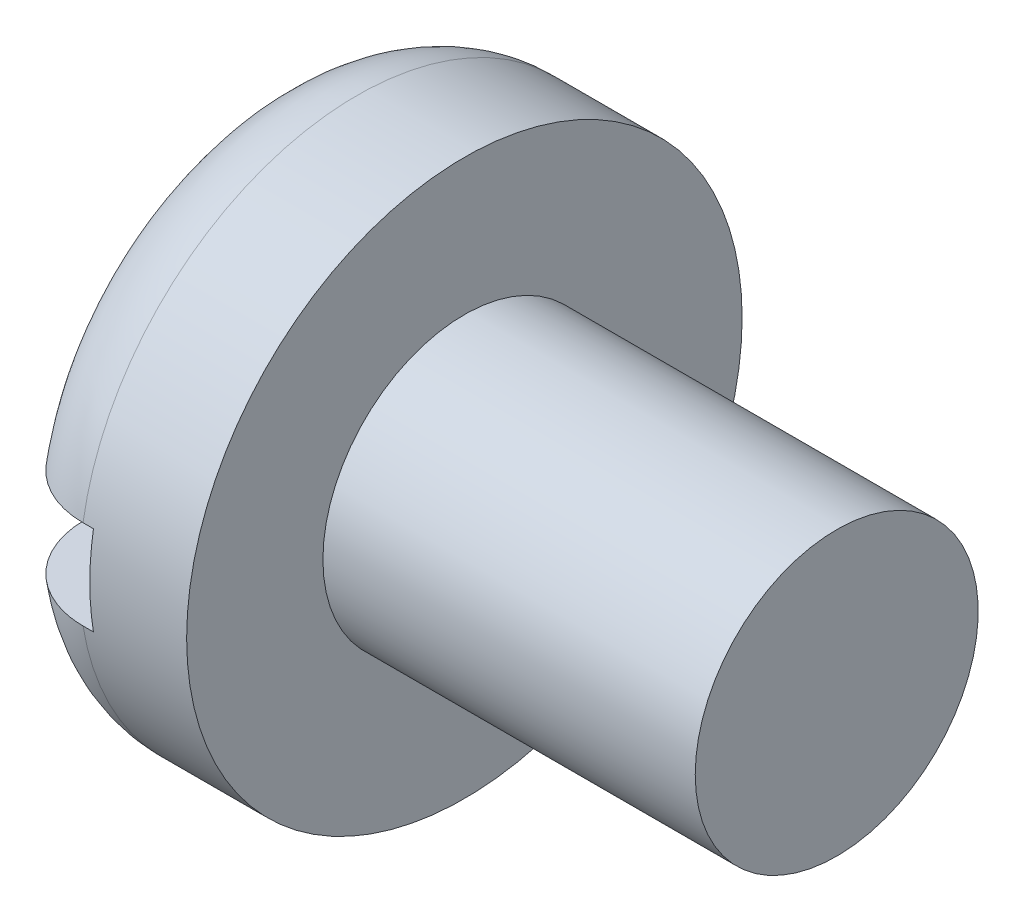
ISO-10303-21;
HEADER;
FILE_DESCRIPTION(('STEP AP214'),'2;1');
FILE_NAME('part.step','',(''),(''),'','','');
FILE_SCHEMA(('AUTOMOTIVE_DESIGN { 1 0 10303 214 1 1 1 1 }'));
ENDSEC;
DATA;
#1=APPLICATION_CONTEXT('core data for automotive mechanical design processes');
#2=APPLICATION_PROTOCOL_DEFINITION('international standard','automotive_design',2000,#1);
#3=PRODUCT_CONTEXT('',#1,'mechanical');
#4=PRODUCT('Part','Part','',(#3));
#5=PRODUCT_RELATED_PRODUCT_CATEGORY('part','',(#4));
#6=PRODUCT_DEFINITION_FORMATION('','',#4);
#7=PRODUCT_DEFINITION_CONTEXT('part definition',#1,'design');
#8=PRODUCT_DEFINITION('design','',#6,#7);
#9=PRODUCT_DEFINITION_SHAPE('','',#8);
#10=(LENGTH_UNIT() NAMED_UNIT(*) SI_UNIT(.MILLI.,.METRE.));
#11=(NAMED_UNIT(*) PLANE_ANGLE_UNIT() SI_UNIT($,.RADIAN.));
#12=(NAMED_UNIT(*) SI_UNIT($,.STERADIAN.) SOLID_ANGLE_UNIT());
#13=UNCERTAINTY_MEASURE_WITH_UNIT(LENGTH_MEASURE(1.E-05),#10,'distance_accuracy_value','');
#14=(GEOMETRIC_REPRESENTATION_CONTEXT(3) GLOBAL_UNCERTAINTY_ASSIGNED_CONTEXT((#13)) GLOBAL_UNIT_ASSIGNED_CONTEXT((#10,
#11,#12)) REPRESENTATION_CONTEXT('',''));
#15=CARTESIAN_POINT('',(0.,0.,0.));
#16=DIRECTION('',(0.,0.,1.));
#17=DIRECTION('',(1.,0.,0.));
#18=AXIS2_PLACEMENT_3D('',#15,#16,#17);
#19=CARTESIAN_POINT('',(0.,0.,0.));
#20=DIRECTION('',(-1.,0.,0.));
#21=DIRECTION('',(0.,0.,1.));
#22=AXIS2_PLACEMENT_3D('',#19,#20,#21);
#23=PLANE('',#22);
#24=DIRECTION('',(0.,0.,-1.));
#25=VECTOR('',#24,1.);
#26=CARTESIAN_POINT('',(0.,0.762,4.7371));
#27=LINE('',#26,#25);
#28=CARTESIAN_POINT('',(0.,0.762,3.09528468642224));
#29=VERTEX_POINT('',#28);
#30=CARTESIAN_POINT('',(0.,0.762,-3.09528468642224));
#31=VERTEX_POINT('',#30);
#32=EDGE_CURVE('E261',#29,#31,#27,.T.);
#33=ORIENTED_EDGE('',*,*,#32,.F.);
#34=CARTESIAN_POINT('',(0.,0.,0.));
#35=DIRECTION('',(-1.,0.,0.));
#36=DIRECTION('',(0.,0.,1.));
#37=AXIS2_PLACEMENT_3D('',#34,#35,#36);
#38=CIRCLE('',#37,3.1877);
#39=EDGE_CURVE('E131',#29,#31,#38,.T.);
#40=ORIENTED_EDGE('',*,*,#39,.T.);
#41=EDGE_LOOP('',(#33,#40));
#42=FACE_BOUND('',#41,.T.);
#43=ADVANCED_FACE('F32',(#42),#23,.T.);
#44=CARTESIAN_POINT('',(1.5494,0.,0.));
#45=DIRECTION('',(-1.,0.,0.));
#46=DIRECTION('',(0.,0.,1.));
#47=AXIS2_PLACEMENT_3D('',#44,#45,#46);
#48=TOROIDAL_SURFACE('',#47,3.1877,1.5494);
#49=CARTESIAN_POINT('',(0.558501926112813,0.762,-4.31200654221501));
#50=CARTESIAN_POINT('',(0.624503765178296,0.762,-4.36775976444543));
#51=CARTESIAN_POINT('',(0.695225612382896,0.762,-4.41801942633811));
#52=CARTESIAN_POINT('',(0.844151505124433,0.762,-4.50601316224373));
#53=CARTESIAN_POINT('',(0.92236377185654,0.762,-4.54373326559598));
#54=CARTESIAN_POINT('',(1.08401891834316,0.762,-4.60546698185312));
#55=CARTESIAN_POINT('',(1.16746096990279,0.762,-4.62948275893514));
#56=CARTESIAN_POINT('',(1.33718114742581,0.762,-4.66308214358628));
#57=CARTESIAN_POINT('',(1.42345859347076,0.762,-4.67266918568556));
#58=CARTESIAN_POINT('',(1.59599349656326,0.762,-4.67712431371996));
#59=CARTESIAN_POINT('',(1.68224921080963,0.762,-4.67206007620656));
#60=CARTESIAN_POINT('',(1.85268417612877,0.762,-4.64750973320941));
#61=CARTESIAN_POINT('',(1.93686338831987,0.762,-4.62802335788842));
#62=CARTESIAN_POINT('',(2.10070146714753,0.762,-4.57522932891186));
#63=CARTESIAN_POINT('',(2.18036349269632,0.762,-4.54193147270308));
#64=CARTESIAN_POINT('',(2.33300611410088,0.762,-4.46250229126884));
#65=CARTESIAN_POINT('',(2.40598663500396,0.762,-4.41637082210019));
#66=CARTESIAN_POINT('',(2.54363358967117,0.762,-4.31234809282823));
#67=CARTESIAN_POINT('',(2.60825349473607,0.762,-4.25439528847686));
#68=CARTESIAN_POINT('',(2.7269818437665,0.762,-4.12857654655652));
#69=CARTESIAN_POINT('',(2.78108986335902,0.762,-4.06071020896418));
#70=CARTESIAN_POINT('',(2.87797164647719,0.762,-3.91615697530799));
#71=CARTESIAN_POINT('',(2.92060423415085,0.762,-3.83937550496835));
#72=CARTESIAN_POINT('',(2.99264178355763,0.762,-3.67984555690315));
#73=CARTESIAN_POINT('',(3.02204576344207,0.762,-3.59709663679252));
#74=CARTESIAN_POINT('',(3.0674229439684,0.762,-3.42631831980952));
#75=CARTESIAN_POINT('',(3.08313122405948,0.762,-3.33821859562874));
#76=CARTESIAN_POINT('',(3.0999361869237,0.762,-3.16064155502913));
#77=CARTESIAN_POINT('',(3.10103109825849,0.762,-3.07116407291408));
#78=CARTESIAN_POINT('',(3.08863195089354,0.762,-2.89088001580641));
#79=CARTESIAN_POINT('',(3.0747561792964,0.762,-2.80009974893249));
#80=CARTESIAN_POINT('',(3.03240614015427,0.762,-2.62201403782426));
#81=CARTESIAN_POINT('',(3.003929743395,0.762,-2.53470910240041));
#82=CARTESIAN_POINT('',(2.93225598384751,0.762,-2.36335935596212));
#83=CARTESIAN_POINT('',(2.88865356948883,0.762,-2.27948384722805));
#84=CARTESIAN_POINT('',(2.78818886774452,0.762,-2.12005822859611));
#85=CARTESIAN_POINT('',(2.7313226216521,0.762,-2.04451061416379));
#86=CARTESIAN_POINT('',(2.60484528137299,0.762,-1.90291211039867));
#87=CARTESIAN_POINT('',(2.53505925121009,0.762,-1.83701701567932));
#88=CARTESIAN_POINT('',(2.38500386232213,0.762,-1.71842259658186));
#89=CARTESIAN_POINT('',(2.30473534648684,0.762,-1.66572221221867));
#90=CARTESIAN_POINT('',(2.1392769109821,0.762,-1.5779040098912));
#91=CARTESIAN_POINT('',(2.0544264707299,0.762,-1.54215071063406));
#92=CARTESIAN_POINT('',(1.87951633706692,0.762,-1.48738077821787));
#93=CARTESIAN_POINT('',(1.78946346838352,0.762,-1.46834272591055));
#94=CARTESIAN_POINT('',(1.61717517770843,0.762,-1.44955306798709));
#95=CARTESIAN_POINT('',(1.53513920825877,0.762,-1.44794929123912));
#96=CARTESIAN_POINT('',(1.37209641155018,0.762,-1.45935294652019));
#97=CARTESIAN_POINT('',(1.29108950257593,0.762,-1.47235921097167));
#98=CARTESIAN_POINT('',(1.13651467818854,0.762,-1.51109533500834));
#99=CARTESIAN_POINT('',(1.06277718056366,0.762,-1.53615976675215));
#100=CARTESIAN_POINT('',(0.920086745041454,0.762,-1.59740532257714));
#101=CARTESIAN_POINT('',(0.851135247588265,0.762,-1.63358977582331));
#102=CARTESIAN_POINT('',(0.714108958882072,0.762,-1.718942347567));
#103=CARTESIAN_POINT('',(0.646533107651883,0.762,-1.76890994938072));
#104=CARTESIAN_POINT('',(0.519751374159238,0.762,-1.87852173742569));
#105=CARTESIAN_POINT('',(0.460548759697031,0.762,-1.93816968218281));
#106=CARTESIAN_POINT('',(0.346254502132061,0.762,-2.07188493390445));
#107=CARTESIAN_POINT('',(0.29214506715978,0.762,-2.14679431352348));
#108=CARTESIAN_POINT('',(0.19671918327371,0.762,-2.3043706901364));
#109=CARTESIAN_POINT('',(0.155405793463288,0.762,-2.38703953601168));
#110=CARTESIAN_POINT('',(0.0854433911441305,0.762,-2.56120465276297));
#111=CARTESIAN_POINT('',(0.0573261553510626,0.762,-2.65291549272235));
#112=CARTESIAN_POINT('',(0.0171259943740959,0.762,-2.8397904136162));
#113=CARTESIAN_POINT('',(0.00504179955930095,0.762,-2.93495422050255));
#114=CARTESIAN_POINT('',(-0.00243284394224364,0.762,-3.12460002150441));
#115=CARTESIAN_POINT('',(0.00194367985651755,0.762,-3.21907270376819));
#116=CARTESIAN_POINT('',(0.0270030891088849,0.762,-3.40586311939546));
#117=CARTESIAN_POINT('',(0.0476878324962477,0.762,-3.49818060599176));
#118=CARTESIAN_POINT('',(0.104114452891124,0.762,-3.67512039467312));
#119=CARTESIAN_POINT('',(0.139399899815146,0.762,-3.75988855837092));
#120=CARTESIAN_POINT('',(0.224057804267139,0.762,-3.92197904384711));
#121=CARTESIAN_POINT('',(0.273409971778087,0.762,-3.99931187711906));
#122=CARTESIAN_POINT('',(0.362898030591871,0.762,-4.11569846401721));
#123=CARTESIAN_POINT('',(0.399055729448776,0.762,-4.15786879061876));
#124=CARTESIAN_POINT('',(0.47566051263418,0.762,-4.23811705888542));
#125=CARTESIAN_POINT('',(0.516107536686558,0.762,-4.27619505804318));
#126=CARTESIAN_POINT('',(0.558501926112813,0.762,-4.31200654221501));
#127=B_SPLINE_CURVE_WITH_KNOTS('',3,(#49,#50,#51,#52,#53,#54,#55,#56,#57,#58,#59,#60,#61,#62,
#63,#64,#65,#66,#67,#68,#69,#70,#71,#72,#73,#74,#75,#76,#77,#78,#79,#80,#81,#82,#83,#84,#85,#86,
#87,#88,#89,#90,#91,#92,#93,#94,#95,#96,#97,#98,#99,#100,#101,#102,#103,#104,#105,#106,#107,
#108,#109,#110,#111,#112,#113,#114,#115,#116,#117,#118,#119,#120,#121,#122,#123,#124,#125,#126),
.UNSPECIFIED.,.T.,.F.,(4,2,2,2,2,2,2,2,2,2,2,2,2,2,2,2,2,2,2,2,2,2,2,2,2,2,2,2,2,2,2,2,2,2,2,2,
2,2,4),(0.,0.258994101891505,0.518275796538277,0.777516534271254,1.03669555411752,
1.294679299718,1.5526678722994,1.8104737477287,2.06828251485318,2.327469409344,2.58666676523829,
2.84892054584938,3.11119378815068,3.37843437188519,3.64570735033487,3.91995971046609,
4.19425207629513,4.47654284617027,4.75891797625169,5.04544083164771,5.33194066209959,
5.60662511443543,5.88095706643619,6.12581843539237,6.370660237374,6.60331700855526,
6.83604350159712,7.08714261010997,7.33833944556595,7.61432498378245,7.89037645000936,
8.17675822425533,8.46311731903239,8.74543790736012,9.02779066405281,9.30191390829516,
9.57564373745578,9.7420035123932,9.90836094985487),.UNSPECIFIED.);
#128=CARTESIAN_POINT('',(1.5494,0.762,-4.67541146959281));
#129=VERTEX_POINT('',#128);
#130=EDGE_CURVE('E46',#31,#129,#127,.T.);
#131=ORIENTED_EDGE('',*,*,#130,.F.);
#132=ORIENTED_EDGE('',*,*,#39,.F.);
#133=CARTESIAN_POINT('',(1.37882833369921,0.762,1.4609344351458));
#134=CARTESIAN_POINT('',(1.45767778229447,0.762,1.45109091146304));
#135=CARTESIAN_POINT('',(1.53743300171642,0.762,1.44805959139375));
#136=CARTESIAN_POINT('',(1.69630228200223,0.762,1.45586904693911));
#137=CARTESIAN_POINT('',(1.77541569477307,0.762,1.46672242384202));
#138=CARTESIAN_POINT('',(1.93043550787148,0.762,1.50154368703999));
#139=CARTESIAN_POINT('',(2.00635040021149,0.762,1.52547413451916));
#140=CARTESIAN_POINT('',(2.1533726247622,0.762,1.58512438315103));
#141=CARTESIAN_POINT('',(2.22447868224917,0.762,1.62084729560072));
#142=CARTESIAN_POINT('',(2.36380098660427,0.762,1.70461613595374));
#143=CARTESIAN_POINT('',(2.43170447465362,0.762,1.75318050771669));
#144=CARTESIAN_POINT('',(2.55937219356342,0.762,1.8600211612785));
#145=CARTESIAN_POINT('',(2.61913392215934,0.762,1.91830041663955));
#146=CARTESIAN_POINT('',(2.73503598097005,0.762,2.04940817358317));
#147=CARTESIAN_POINT('',(2.79018656319344,0.762,2.12311412557353));
#148=CARTESIAN_POINT('',(2.88792514517709,0.762,2.27844361261995));
#149=CARTESIAN_POINT('',(2.93050965826346,0.762,2.3600693368217));
#150=CARTESIAN_POINT('',(3.00341128676537,0.762,2.53260720000707));
#151=CARTESIAN_POINT('',(3.03315502097171,0.762,2.62376267670105));
#152=CARTESIAN_POINT('',(3.07671140531373,0.762,2.80981066624688));
#153=CARTESIAN_POINT('',(3.0905245995442,0.762,2.90470305135316));
#154=CARTESIAN_POINT('',(3.10149739213467,0.762,3.09429234838807));
#155=CARTESIAN_POINT('',(3.09885850646894,0.762,3.18897746953199));
#156=CARTESIAN_POINT('',(3.07721758868585,0.762,3.37646433803129));
#157=CARTESIAN_POINT('',(3.05821795703654,0.762,3.46926635963284));
#158=CARTESIAN_POINT('',(3.00500613590422,0.762,3.64742438271371));
#159=CARTESIAN_POINT('',(2.97125875943939,0.762,3.7329192213955));
#160=CARTESIAN_POINT('',(2.88950418407281,0.762,3.89679807877195));
#161=CARTESIAN_POINT('',(2.84149915242691,0.762,3.97518317583111));
#162=CARTESIAN_POINT('',(2.73400432376312,0.762,4.12041160126862));
#163=CARTESIAN_POINT('',(2.67485481945552,0.762,4.18750691479756));
#164=CARTESIAN_POINT('',(2.54593690180154,0.762,4.31057586450795));
#165=CARTESIAN_POINT('',(2.47616967288336,0.762,4.36655073959268));
#166=CARTESIAN_POINT('',(2.32943350764576,0.762,4.46470134856446));
#167=CARTESIAN_POINT('',(2.25262544262633,0.762,4.50711769840939));
#168=CARTESIAN_POINT('',(2.09291894695908,0.762,4.57828304222571));
#169=CARTESIAN_POINT('',(2.01002094460928,0.762,4.60703299627798));
#170=CARTESIAN_POINT('',(1.84150019062737,0.762,4.64974258940861));
#171=CARTESIAN_POINT('',(1.75591889822596,0.762,4.66386594716439));
#172=CARTESIAN_POINT('',(1.58360123646141,0.762,4.67746939166987));
#173=CARTESIAN_POINT('',(1.49686490828539,0.762,4.67694999917148));
#174=CARTESIAN_POINT('',(1.32513063187046,0.762,4.6613215764109));
#175=CARTESIAN_POINT('',(1.24012642731877,0.762,4.64628115948126));
#176=CARTESIAN_POINT('',(1.07384531926871,0.762,4.60216090883303));
#177=CARTESIAN_POINT('',(0.992568393414692,0.762,4.57308115933222));
#178=CARTESIAN_POINT('',(0.835914381286785,0.762,4.50169622747781));
#179=CARTESIAN_POINT('',(0.760545540632384,0.762,4.45937295876651));
#180=CARTESIAN_POINT('',(0.617915726171508,0.762,4.36276228903086));
#181=CARTESIAN_POINT('',(0.550654940865141,0.762,4.3084746099349));
#182=CARTESIAN_POINT('',(0.425586504282354,0.762,4.18906699603163));
#183=CARTESIAN_POINT('',(0.367853500016325,0.762,4.12386890642169));
#184=CARTESIAN_POINT('',(0.26397492755456,0.762,3.98482211119811));
#185=CARTESIAN_POINT('',(0.217829943315976,0.762,3.91097296990538));
#186=CARTESIAN_POINT('',(0.137704223529321,0.762,3.75562007058942));
#187=CARTESIAN_POINT('',(0.103905208312929,0.762,3.6740226386045));
#188=CARTESIAN_POINT('',(0.0501687362886253,0.762,3.50638994597293));
#189=CARTESIAN_POINT('',(0.0302325582974674,0.762,3.42035427669465));
#190=CARTESIAN_POINT('',(0.00429460618638988,0.762,3.24431959617554));
#191=CARTESIAN_POINT('',(-0.00139829341690311,0.762,3.15427514183594));
#192=CARTESIAN_POINT('',(0.00197952351395726,0.762,2.97446875605361));
#193=CARTESIAN_POINT('',(0.0110521538081449,0.762,2.88470686274444));
#194=CARTESIAN_POINT('',(0.0439664152909467,0.762,2.70532877683696));
#195=CARTESIAN_POINT('',(0.0682152853217969,0.762,2.61578733481287));
#196=CARTESIAN_POINT('',(0.130993773920929,0.762,2.44186007826723));
#197=CARTESIAN_POINT('',(0.169525419479398,0.762,2.35747499750977));
#198=CARTESIAN_POINT('',(0.260980479006912,0.762,2.19386732852946));
#199=CARTESIAN_POINT('',(0.314265924139127,0.762,2.11484686428402));
#200=CARTESIAN_POINT('',(0.433350313250186,0.762,1.96677891182421));
#201=CARTESIAN_POINT('',(0.499156847458473,0.762,1.89773751778139));
#202=CARTESIAN_POINT('',(0.641776309859398,0.762,1.77184054558599));
#203=CARTESIAN_POINT('',(0.718608095024868,0.762,1.7150062703571));
#204=CARTESIAN_POINT('',(0.881210651545337,0.762,1.61621194564139));
#205=CARTESIAN_POINT('',(0.966961725807488,0.762,1.57421998500052));
#206=CARTESIAN_POINT('',(1.10793905580931,0.762,1.52136420348251));
#207=CARTESIAN_POINT('',(1.16108363018855,0.762,1.50481253647326));
#208=CARTESIAN_POINT('',(1.26894730021348,0.762,1.47804132435307));
#209=CARTESIAN_POINT('',(1.3236661639158,0.762,1.46782085140271));
#210=CARTESIAN_POINT('',(1.37882833369921,0.762,1.4609344351458));
#211=B_SPLINE_CURVE_WITH_KNOTS('',3,(#133,#134,#135,#136,#137,#138,#139,#140,#141,#142,#143,
#144,#145,#146,#147,#148,#149,#150,#151,#152,#153,#154,#155,#156,#157,#158,#159,#160,#161,#162,
#163,#164,#165,#166,#167,#168,#169,#170,#171,#172,#173,#174,#175,#176,#177,#178,#179,#180,#181,
#182,#183,#184,#185,#186,#187,#188,#189,#190,#191,#192,#193,#194,#195,#196,#197,#198,#199,#200,
#201,#202,#203,#204,#205,#206,#207,#208,#209,#210),.UNSPECIFIED.,.T.,.F.,(4,2,2,2,2,2,2,2,2,2,2,
2,2,2,2,2,2,2,2,2,2,2,2,2,2,2,2,2,2,2,2,2,2,2,2,2,2,2,4),(0.,0.238172297169051,
0.476560905003676,0.714270570137412,0.952043002238672,1.20147671068863,1.45098690725547,
1.72592511426441,2.00093953607151,2.28720918580222,2.57346905793364,2.85622957585298,
3.13894861388137,3.41333595437419,3.68768160754365,3.95471342007754,4.22171546648852,
4.48367558515077,4.74561729807635,5.0045942680148,5.26356202775844,5.52131209673926,
5.77906061957298,6.03716269109025,6.29527076193622,6.55531378193514,6.81536990369968,
7.0791127102478,7.34287984327296,7.61231920604479,7.88179349362824,8.15882855198505,
8.43590294180611,8.7204930804325,9.00525628918085,9.29051247812746,9.57515157785255,
9.74179861294387,9.90842122005407),.UNSPECIFIED.);
#212=CARTESIAN_POINT('',(1.5494,0.762,4.67541146959281));
#213=VERTEX_POINT('',#212);
#214=EDGE_CURVE('E175',#213,#29,#211,.T.);
#215=ORIENTED_EDGE('',*,*,#214,.F.);
#216=CARTESIAN_POINT('',(1.5494,0.,0.));
#217=DIRECTION('',(-1.,0.,0.));
#218=DIRECTION('',(0.,0.,1.));
#219=AXIS2_PLACEMENT_3D('',#216,#217,#218);
#220=CIRCLE('',#219,4.7371);
#221=EDGE_CURVE('E104',#213,#129,#220,.T.);
#222=ORIENTED_EDGE('',*,*,#221,.T.);
#223=EDGE_LOOP('',(#131,#132,#215,#222));
#224=FACE_BOUND('',#223,.T.);
#225=ADVANCED_FACE('F148',(#224),#48,.T.);
#226=CARTESIAN_POINT('',(-25.4,0.,0.));
#227=DIRECTION('',(-1.,0.,0.));
#228=DIRECTION('',(0.,0.,1.));
#229=AXIS2_PLACEMENT_3D('',#226,#227,#228);
#230=CYLINDRICAL_SURFACE('',#229,2.413);
#231=CARTESIAN_POINT('',(9.7282,0.,0.));
#232=DIRECTION('',(-1.,0.,0.));
#233=DIRECTION('',(0.,0.,1.));
#234=AXIS2_PLACEMENT_3D('',#231,#232,#233);
#235=CIRCLE('',#234,2.413);
#236=CARTESIAN_POINT('',(9.7282,0.,2.413));
#237=VERTEX_POINT('',#236);
#238=EDGE_CURVE('E94',#237,#237,#235,.T.);
#239=ORIENTED_EDGE('',*,*,#238,.T.);
#240=EDGE_LOOP('',(#239));
#241=FACE_BOUND('',#240,.T.);
#242=CARTESIAN_POINT('',(3.3782,0.,0.));
#243=DIRECTION('',(-1.,0.,0.));
#244=DIRECTION('',(0.,0.,1.));
#245=AXIS2_PLACEMENT_3D('',#242,#243,#244);
#246=CIRCLE('',#245,2.413);
#247=CARTESIAN_POINT('',(3.3782,0.,2.413));
#248=VERTEX_POINT('',#247);
#249=EDGE_CURVE('E127',#248,#248,#246,.T.);
#250=ORIENTED_EDGE('',*,*,#249,.F.);
#251=EDGE_LOOP('',(#250));
#252=FACE_BOUND('',#251,.T.);
#253=ADVANCED_FACE('F34',(#241,#252),#230,.T.);
#254=CARTESIAN_POINT('',(9.7282,2.413,0.));
#255=DIRECTION('',(1.,0.,0.));
#256=DIRECTION('',(0.,0.,-1.));
#257=AXIS2_PLACEMENT_3D('',#254,#255,#256);
#258=PLANE('',#257);
#259=ORIENTED_EDGE('',*,*,#238,.F.);
#260=EDGE_LOOP('',(#259));
#261=FACE_BOUND('',#260,.T.);
#262=ADVANCED_FACE('F139',(#261),#258,.T.);
#263=DIRECTION('',(0.,0.,1.));
#264=VECTOR('',#263,1.);
#265=CARTESIAN_POINT('',(0.,-0.761999999999999,-4.7371));
#266=LINE('',#265,#264);
#267=CARTESIAN_POINT('',(0.,-0.761999999999999,-3.09528468642224));
#268=VERTEX_POINT('',#267);
#269=CARTESIAN_POINT('',(0.,-0.762,3.09528468642224));
#270=VERTEX_POINT('',#269);
#271=EDGE_CURVE('E98',#268,#270,#266,.T.);
#272=ORIENTED_EDGE('',*,*,#271,.F.);
#273=EDGE_CURVE('E121',#268,#270,#38,.T.);
#274=ORIENTED_EDGE('',*,*,#273,.T.);
#275=EDGE_LOOP('',(#272,#274));
#276=FACE_BOUND('',#275,.T.);
#277=ADVANCED_FACE('F141',(#276),#23,.T.);
#278=CARTESIAN_POINT('',(0.558501926112812,-0.761999999999999,-4.31200654221501));
#279=CARTESIAN_POINT('',(0.491152564912093,-0.761999999999999,-4.25510429288787));
#280=CARTESIAN_POINT('',(0.428614834513411,-0.761999999999999,-4.19239155349494));
#281=CARTESIAN_POINT('',(0.314967861312948,-0.761999999999999,-4.05725152581267));
#282=CARTESIAN_POINT('',(0.263875144856068,-0.761999999999999,-3.98481042818603));
#283=CARTESIAN_POINT('',(0.174588149722149,-0.761999999999999,-3.83249983566908));
#284=CARTESIAN_POINT('',(0.136377016974116,-0.761999999999999,-3.75264022303293));
#285=CARTESIAN_POINT('',(0.0736922993271104,-0.761999999999999,-3.58773867732881));
#286=CARTESIAN_POINT('',(0.0492150862182029,-0.761999999999999,-3.50269811954393));
#287=CARTESIAN_POINT('',(0.014192150213959,-0.761999999999999,-3.32842838202762));
#288=CARTESIAN_POINT('',(0.00386811432536975,-0.762,-3.23915472357864));
#289=CARTESIAN_POINT('',(-0.00206808170925774,-0.762,-3.06012013506255));
#290=CARTESIAN_POINT('',(0.00232231448560327,-0.762,-2.97035912303202));
#291=CARTESIAN_POINT('',(0.0258037337430631,-0.762,-2.79029270514169));
#292=CARTESIAN_POINT('',(0.0452923240568607,-0.762,-2.70003918847874));
#293=CARTESIAN_POINT('',(0.0987154706806525,-0.762,-2.52391571899524));
#294=CARTESIAN_POINT('',(0.132652201729321,-0.762,-2.43804642826976));
#295=CARTESIAN_POINT('',(0.215105607879785,-0.762,-2.27056324952855));
#296=CARTESIAN_POINT('',(0.264009257830925,-0.762,-2.1891396732848));
#297=CARTESIAN_POINT('',(0.374685093336511,-0.762,-2.03551989369491));
#298=CARTESIAN_POINT('',(0.436461582362998,-0.762,-1.96332678921079));
#299=CARTESIAN_POINT('',(0.571901084783498,-0.762,-1.82987642701289));
#300=CARTESIAN_POINT('',(0.64565584494169,-0.762,-1.76871195171189));
#301=CARTESIAN_POINT('',(0.802892614678684,-0.762,-1.66045909410649));
#302=CARTESIAN_POINT('',(0.886371139848721,-0.762,-1.6133656910163));
#303=CARTESIAN_POINT('',(1.05586995736113,-0.762,-1.53798845685435));
#304=CARTESIAN_POINT('',(1.1414834729537,-0.762,-1.50879596636845));
#305=CARTESIAN_POINT('',(1.31666789356952,-0.762,-1.46723032804954));
#306=CARTESIAN_POINT('',(1.406233898672,-0.762,-1.45483692732656));
#307=CARTESIAN_POINT('',(1.5762090648677,-0.762,-1.44822321353845));
#308=CARTESIAN_POINT('',(1.65655129406076,-0.762,-1.4521679467392));
#309=CARTESIAN_POINT('',(1.81534183969208,-0.762,-1.47388097438422));
#310=CARTESIAN_POINT('',(1.89378994312367,-0.762,-1.49165081615481));
#311=CARTESIAN_POINT('',(2.04474850503141,-0.762,-1.53932398566323));
#312=CARTESIAN_POINT('',(2.11735726213125,-0.762,-1.56891990502597));
#313=CARTESIAN_POINT('',(2.25718878601971,-0.762,-1.638850924605));
#314=CARTESIAN_POINT('',(2.32440993387053,-0.762,-1.67918923720977));
#315=CARTESIAN_POINT('',(2.45820671064055,-0.762,-1.77339979931412));
#316=CARTESIAN_POINT('',(2.52414162317232,-0.762,-1.82818149182411));
#317=CARTESIAN_POINT('',(2.64685141404731,-0.762,-1.94719089344218));
#318=CARTESIAN_POINT('',(2.70362267114789,-0.762,-2.01142231777088));
#319=CARTESIAN_POINT('',(2.81152493458037,-0.762,-2.15385822992829));
#320=CARTESIAN_POINT('',(2.86168539166983,-0.762,-2.23280048443467));
#321=CARTESIAN_POINT('',(2.94843563511226,-0.762,-2.39782857514642));
#322=CARTESIAN_POINT('',(2.98502301039533,-0.762,-2.48391567721456));
#323=CARTESIAN_POINT('',(3.04425516424255,-0.762,-2.66319990946349));
#324=CARTESIAN_POINT('',(3.06652426278428,-0.762,-2.7565217348748));
#325=CARTESIAN_POINT('',(3.09474451783416,-0.762,-2.9456081193815));
#326=CARTESIAN_POINT('',(3.10069683902635,-0.762,-3.04137250363563));
#327=CARTESIAN_POINT('',(3.09589375979818,-0.762,-3.23063644947121));
#328=CARTESIAN_POINT('',(3.08545903861472,-0.761999999999999,-3.32414401278441));
#329=CARTESIAN_POINT('',(3.04854124903563,-0.761999999999999,-3.50794011366493));
#330=CARTESIAN_POINT('',(3.02206071094691,-0.761999999999999,-3.59822915639275));
#331=CARTESIAN_POINT('',(2.9546776114288,-0.761999999999999,-3.77014681722372));
#332=CARTESIAN_POINT('',(2.91422932680406,-0.761999999999999,-3.85195353715409));
#333=CARTESIAN_POINT('',(2.81983446353514,-0.761999999999999,-4.00737155656926));
#334=CARTESIAN_POINT('',(2.76588979837817,-0.761999999999999,-4.08098401568246));
#335=CARTESIAN_POINT('',(2.64751338514675,-0.761999999999999,-4.21599498023107));
#336=CARTESIAN_POINT('',(2.58337662377773,-0.761999999999999,-4.27765223995573));
#337=CARTESIAN_POINT('',(2.44550672331506,-0.761999999999999,-4.38909689383717));
#338=CARTESIAN_POINT('',(2.37177453328062,-0.761999999999999,-4.4388854605186));
#339=CARTESIAN_POINT('',(2.21816789397275,-0.761999999999999,-4.5243180688366));
#340=CARTESIAN_POINT('',(2.13841889437307,-0.761999999999999,-4.56018777907692));
#341=CARTESIAN_POINT('',(1.97399579919607,-0.761999999999999,-4.61787909578662));
#342=CARTESIAN_POINT('',(1.88932222008806,-0.761999999999999,-4.63970217252181));
#343=CARTESIAN_POINT('',(1.7183404116503,-0.761999999999999,-4.66849691658517));
#344=CARTESIAN_POINT('',(1.63205623069756,-0.761999999999999,-4.67561157939618));
#345=CARTESIAN_POINT('',(1.45949798771064,-0.761999999999999,-4.67520277669786));
#346=CARTESIAN_POINT('',(1.37322393325918,-0.761999999999999,-4.66767574560218));
#347=CARTESIAN_POINT('',(1.20341487016998,-0.761999999999999,-4.63824975397247));
#348=CARTESIAN_POINT('',(1.11987308584938,-0.761999999999999,-4.6163897108409));
#349=CARTESIAN_POINT('',(0.957711469240045,-0.761999999999999,-4.55899900287524));
#350=CARTESIAN_POINT('',(0.879085352237431,-0.761999999999999,-4.52348622663794));
#351=CARTESIAN_POINT('',(0.760477906935332,-0.761999999999999,-4.45747431536941));
#352=CARTESIAN_POINT('',(0.718130790262285,-0.761999999999999,-4.43112971566478));
#353=CARTESIAN_POINT('',(0.636177326406412,-0.761999999999999,-4.37447772967046));
#354=CARTESIAN_POINT('',(0.59657095790462,-0.761999999999999,-4.34417037421045));
#355=CARTESIAN_POINT('',(0.558501926112812,-0.761999999999999,-4.31200654221501));
#356=B_SPLINE_CURVE_WITH_KNOTS('',3,(#278,#279,#280,#281,#282,#283,#284,#285,#286,#287,#288,
#289,#290,#291,#292,#293,#294,#295,#296,#297,#298,#299,#300,#301,#302,#303,#304,#305,#306,#307,
#308,#309,#310,#311,#312,#313,#314,#315,#316,#317,#318,#319,#320,#321,#322,#323,#324,#325,#326,
#327,#328,#329,#330,#331,#332,#333,#334,#335,#336,#337,#338,#339,#340,#341,#342,#343,#344,#345,
#346,#347,#348,#349,#350,#351,#352,#353,#354,#355),.UNSPECIFIED.,.T.,.F.,(4,2,2,2,2,2,2,2,2,2,2,
2,2,2,2,2,2,2,2,2,2,2,2,2,2,2,2,2,2,2,2,2,2,2,2,2,2,2,4),(0.,0.264321249709477,
0.529021747719585,0.793374559088785,1.05765750113776,1.32603445867179,1.59445804379904,
1.87020053938542,2.14598455450099,2.42960686175881,2.71332413831537,2.99932699344042,
3.28522767592386,3.5550543271206,3.82455538659896,4.06465760592409,4.30478670170633,
4.53904239195481,4.77336821247369,5.02947363167532,5.28568001072727,5.56499467911416,
5.84435894015061,6.13078250426348,6.41718562306184,6.69805355932954,6.97887721631838,
7.25131504686978,7.52371427365041,7.78932223927963,8.05490395424498,8.31597929829744,
8.57702731106105,8.83552524144986,9.09408612986041,9.35194785760005,9.60947286526673,
9.75888085013037,9.9082876726903),.UNSPECIFIED.);
#357=CARTESIAN_POINT('',(1.5494,-0.761999999999999,-4.67541146959281));
#358=VERTEX_POINT('',#357);
#359=EDGE_CURVE('E111',#358,#268,#356,.T.);
#360=ORIENTED_EDGE('',*,*,#359,.F.);
#361=CARTESIAN_POINT('',(1.5494,-0.762,4.67541146959281));
#362=VERTEX_POINT('',#361);
#363=EDGE_CURVE('E119',#358,#362,#220,.T.);
#364=ORIENTED_EDGE('',*,*,#363,.T.);
#365=CARTESIAN_POINT('',(1.37882833369921,-0.762,1.4609344351458));
#366=CARTESIAN_POINT('',(1.29548490477117,-0.762,1.47135302602046));
#367=CARTESIAN_POINT('',(1.21300925714157,-0.762,1.4894038196471));
#368=CARTESIAN_POINT('',(1.05237342767979,-0.762,1.53958769482367));
#369=CARTESIAN_POINT('',(0.974222839062994,-0.762,1.57175077104046));
#370=CARTESIAN_POINT('',(0.824646480077098,-0.762,1.64825007614011));
#371=CARTESIAN_POINT('',(0.753189715764409,-0.762,1.69252605462361));
#372=CARTESIAN_POINT('',(0.618041430640507,-0.762,1.79158252707999));
#373=CARTESIAN_POINT('',(0.554348524074856,-0.762,1.84636114195561));
#374=CARTESIAN_POINT('',(0.431349467343424,-0.762,1.96936985435651));
#375=CARTESIAN_POINT('',(0.372750888139931,-0.762,2.03830813827402));
#376=CARTESIAN_POINT('',(0.267204555606837,-0.762,2.18460225217929));
#377=CARTESIAN_POINT('',(0.220260341363347,-0.762,2.26196062886715));
#378=CARTESIAN_POINT('',(0.136933238073087,-0.762,2.42766321476512));
#379=CARTESIAN_POINT('',(0.1012878959796,-0.762,2.51637987224135));
#380=CARTESIAN_POINT('',(0.0454671069475474,-0.762,2.69856397606468));
#381=CARTESIAN_POINT('',(0.025292272980576,-0.762,2.79203161049827));
#382=CARTESIAN_POINT('',(0.00128364931223659,-0.762,2.9806156301944));
#383=CARTESIAN_POINT('',(-0.00262545852748761,-0.762,3.0757223638261));
#384=CARTESIAN_POINT('',(0.00607036453553267,-0.762,3.26518269953887));
#385=CARTESIAN_POINT('',(0.0186728817880234,-0.762,3.35953640966775));
#386=CARTESIAN_POINT('',(0.0596598072423912,-0.762,3.54194771131829));
#387=CARTESIAN_POINT('',(0.0875873565129427,-0.762,3.63010792405326));
#388=CARTESIAN_POINT('',(0.158269699055968,-0.762,3.80027318835562));
#389=CARTESIAN_POINT('',(0.20102222126402,-0.762,3.88227918035994));
#390=CARTESIAN_POINT('',(0.298820410029728,-0.762,4.03538255614594));
#391=CARTESIAN_POINT('',(0.353489470248539,-0.762,4.10672060615747));
#392=CARTESIAN_POINT('',(0.47425746546101,-0.762,4.23896035013415));
#393=CARTESIAN_POINT('',(0.540355013583745,-0.762,4.29986330863613));
#394=CARTESIAN_POINT('',(0.680624239631865,-0.762,4.40821102582204));
#395=CARTESIAN_POINT('',(0.754602838128099,-0.762,4.45590586178077));
#396=CARTESIAN_POINT('',(0.909597561907955,-0.762,4.53801130561728));
#397=CARTESIAN_POINT('',(0.990613140256662,-0.762,4.57242294477471));
#398=CARTESIAN_POINT('',(1.15626563037509,-0.762,4.62655803747708));
#399=CARTESIAN_POINT('',(1.24084324107735,-0.762,4.64646307170189));
#400=CARTESIAN_POINT('',(1.41214492053152,-0.762,4.67169680531441));
#401=CARTESIAN_POINT('',(1.49886889876446,-0.762,4.67702611835206));
#402=CARTESIAN_POINT('',(1.67145159171071,-0.762,4.67296051239436));
#403=CARTESIAN_POINT('',(1.75731238351017,-0.762,4.66365310034574));
#404=CARTESIAN_POINT('',(1.92625106206516,-0.762,4.6307563838051));
#405=CARTESIAN_POINT('',(2.00932898058705,-0.762,4.60716724239703));
#406=CARTESIAN_POINT('',(2.17037298876424,-0.762,4.54640430597629));
#407=CARTESIAN_POINT('',(2.24833815812872,-0.762,4.5092280731708));
#408=CARTESIAN_POINT('',(2.39697114139837,-0.762,4.42239128436219));
#409=CARTESIAN_POINT('',(2.46763883385077,-0.762,4.37273052062477));
#410=CARTESIAN_POINT('',(2.60016601910269,-0.762,4.26202970771171));
#411=CARTESIAN_POINT('',(2.66196772636924,-0.762,4.20092050692953));
#412=CARTESIAN_POINT('',(2.77458746814587,-0.762,4.06930910584998));
#413=CARTESIAN_POINT('',(2.82540498538684,-0.762,3.99880646344787));
#414=CARTESIAN_POINT('',(2.9153407494366,-0.762,3.84946605751743));
#415=CARTESIAN_POINT('',(2.95430103492954,-0.762,3.77053321351044));
#416=CARTESIAN_POINT('',(3.01870563285701,-0.762,3.60733977122305));
#417=CARTESIAN_POINT('',(3.0441489049634,-0.762,3.52307876342231));
#418=CARTESIAN_POINT('',(3.08137803256585,-0.762,3.34982854551276));
#419=CARTESIAN_POINT('',(3.09288021004063,-0.762,3.26077844320819));
#420=CARTESIAN_POINT('',(3.10118839579194,-0.762,3.08199977372229));
#421=CARTESIAN_POINT('',(3.09799245058115,-0.762,2.99227111793852));
#422=CARTESIAN_POINT('',(3.07692074263964,-0.762,2.81209981369703));
#423=CARTESIAN_POINT('',(3.0586509905307,-0.762,2.72170328941819));
#424=CARTESIAN_POINT('',(3.00762855063853,-0.762,2.5450968923499));
#425=CARTESIAN_POINT('',(2.9748737531519,-0.762,2.45888763145347));
#426=CARTESIAN_POINT('',(2.89474693921662,-0.762,2.29050172594024));
#427=CARTESIAN_POINT('',(2.84698299623625,-0.762,2.20851139876333));
#428=CARTESIAN_POINT('',(2.73849829222487,-0.762,2.0535642244038));
#429=CARTESIAN_POINT('',(2.67777360774824,-0.762,1.98061012323849));
#430=CARTESIAN_POINT('',(2.5442416914308,-0.762,1.84532570695225));
#431=CARTESIAN_POINT('',(2.47132498492376,-0.762,1.78310308971289));
#432=CARTESIAN_POINT('',(2.31556926563142,-0.762,1.6725277628924));
#433=CARTESIAN_POINT('',(2.23273054341227,-0.762,1.62417464728374));
#434=CARTESIAN_POINT('',(2.0639392938633,-0.762,1.54601569772672));
#435=CARTESIAN_POINT('',(1.97837680579029,-0.762,1.51537141474185));
#436=CARTESIAN_POINT('',(1.80309077281169,-0.762,1.47096923909288));
#437=CARTESIAN_POINT('',(1.71337914646691,-0.762,1.45716575977573));
#438=CARTESIAN_POINT('',(1.58252422350983,-0.762,1.45009171010231));
#439=CARTESIAN_POINT('',(1.54166636395233,-0.762,1.4497186923329));
#440=CARTESIAN_POINT('',(1.46008006855318,-0.762,1.45260730092912));
#441=CARTESIAN_POINT('',(1.41935162483754,-0.762,1.45586870174971));
#442=CARTESIAN_POINT('',(1.37882833369921,-0.762,1.4609344351458));
#443=B_SPLINE_CURVE_WITH_KNOTS('',3,(#365,#366,#367,#368,#369,#370,#371,#372,#373,#374,#375,
#376,#377,#378,#379,#380,#381,#382,#383,#384,#385,#386,#387,#388,#389,#390,#391,#392,#393,#394,
#395,#396,#397,#398,#399,#400,#401,#402,#403,#404,#405,#406,#407,#408,#409,#410,#411,#412,#413,
#414,#415,#416,#417,#418,#419,#420,#421,#422,#423,#424,#425,#426,#427,#428,#429,#430,#431,#432,
#433,#434,#435,#436,#437,#438,#439,#440,#441,#442),.UNSPECIFIED.,.T.,.F.,(4,2,2,2,2,2,2,2,2,2,2,
2,2,2,2,2,2,2,2,2,2,2,2,2,2,2,2,2,2,2,2,2,2,2,2,2,2,2,4),(0.,0.251807855868186,
0.504153523990005,0.755266139303187,1.00633386822611,1.27659472457869,1.54693755105099,
1.83240069953819,2.11787515804569,2.40202625124972,2.68613581220964,2.96220269250017,
3.23822730027555,3.5065442663494,3.7748286944214,4.03761870892237,4.30038831685028,
4.55980950813479,4.81921977740411,5.07708502613868,5.33494733034985,5.59285592288742,
5.8507688071365,6.11029295041603,6.36982931258376,6.63268543850028,6.89556179203781,
7.16370198458055,7.43187781593325,7.70729373200795,7.98274977480278,8.2660982620277,
8.54953264581441,8.83566408806655,9.1217871530095,9.39293142845965,9.66334009874442,
9.78578186092451,9.90821602502729),.UNSPECIFIED.);
#444=EDGE_CURVE('E122',#270,#362,#443,.T.);
#445=ORIENTED_EDGE('',*,*,#444,.F.);
#446=ORIENTED_EDGE('',*,*,#273,.F.);
#447=EDGE_LOOP('',(#360,#364,#445,#446));
#448=FACE_BOUND('',#447,.T.);
#449=ADVANCED_FACE('F117',(#448),#48,.T.);
#450=CARTESIAN_POINT('',(-25.4,0.,0.));
#451=DIRECTION('',(-1.,0.,0.));
#452=DIRECTION('',(0.,0.,1.));
#453=AXIS2_PLACEMENT_3D('',#450,#451,#452);
#454=CYLINDRICAL_SURFACE('',#453,4.7371);
#455=DIRECTION('',(-1.,0.,0.));
#456=VECTOR('',#455,1.);
#457=CARTESIAN_POINT('',(-25.4,0.762,-4.67541146959281));
#458=LINE('',#457,#456);
#459=CARTESIAN_POINT('',(1.7272,0.762,-4.67541146959281));
#460=VERTEX_POINT('',#459);
#461=EDGE_CURVE('E11',#129,#460,#458,.F.);
#462=ORIENTED_EDGE('',*,*,#461,.F.);
#463=ORIENTED_EDGE('',*,*,#221,.F.);
#464=DIRECTION('',(-1.,0.,0.));
#465=VECTOR('',#464,1.);
#466=CARTESIAN_POINT('',(-25.4,0.762,4.67541146959281));
#467=LINE('',#466,#465);
#468=CARTESIAN_POINT('',(1.7272,0.762,4.67541146959281));
#469=VERTEX_POINT('',#468);
#470=EDGE_CURVE('E53',#469,#213,#467,.T.);
#471=ORIENTED_EDGE('',*,*,#470,.F.);
#472=CARTESIAN_POINT('',(1.7272,0.,0.));
#473=DIRECTION('',(-1.,0.,0.));
#474=DIRECTION('',(0.,0.,1.));
#475=AXIS2_PLACEMENT_3D('',#472,#473,#474);
#476=CIRCLE('',#475,4.7371);
#477=CARTESIAN_POINT('',(1.7272,-0.762,4.67541146959281));
#478=VERTEX_POINT('',#477);
#479=EDGE_CURVE('E84',#469,#478,#476,.F.);
#480=ORIENTED_EDGE('',*,*,#479,.T.);
#481=DIRECTION('',(-1.,0.,0.));
#482=VECTOR('',#481,1.);
#483=CARTESIAN_POINT('',(-25.4,-0.762,4.67541146959281));
#484=LINE('',#483,#482);
#485=EDGE_CURVE('E93',#362,#478,#484,.F.);
#486=ORIENTED_EDGE('',*,*,#485,.F.);
#487=ORIENTED_EDGE('',*,*,#363,.F.);
#488=DIRECTION('',(-1.,0.,0.));
#489=VECTOR('',#488,1.);
#490=CARTESIAN_POINT('',(-25.4,-0.761999999999999,-4.67541146959281));
#491=LINE('',#490,#489);
#492=CARTESIAN_POINT('',(1.7272,-0.761999999999999,-4.67541146959281));
#493=VERTEX_POINT('',#492);
#494=EDGE_CURVE('E40',#493,#358,#491,.T.);
#495=ORIENTED_EDGE('',*,*,#494,.F.);
#496=EDGE_CURVE('E96',#493,#460,#476,.F.);
#497=ORIENTED_EDGE('',*,*,#496,.T.);
#498=EDGE_LOOP('',(#462,#463,#471,#480,#486,#487,#495,#497));
#499=FACE_BOUND('',#498,.T.);
#500=CARTESIAN_POINT('',(3.3782,0.,0.));
#501=DIRECTION('',(-1.,0.,0.));
#502=DIRECTION('',(0.,0.,1.));
#503=AXIS2_PLACEMENT_3D('',#500,#501,#502);
#504=CIRCLE('',#503,4.7371);
#505=CARTESIAN_POINT('',(3.3782,0.,4.7371));
#506=VERTEX_POINT('',#505);
#507=EDGE_CURVE('E124',#506,#506,#504,.T.);
#508=ORIENTED_EDGE('',*,*,#507,.T.);
#509=EDGE_LOOP('',(#508));
#510=FACE_BOUND('',#509,.T.);
#511=ADVANCED_FACE('F101',(#499,#510),#454,.T.);
#512=CARTESIAN_POINT('',(3.3782,2.413,0.));
#513=DIRECTION('',(-1.,0.,0.));
#514=DIRECTION('',(0.,0.,1.));
#515=AXIS2_PLACEMENT_3D('',#512,#513,#514);
#516=PLANE('',#515);
#517=ORIENTED_EDGE('',*,*,#507,.F.);
#518=EDGE_LOOP('',(#517));
#519=FACE_BOUND('',#518,.T.);
#520=ORIENTED_EDGE('',*,*,#249,.T.);
#521=EDGE_LOOP('',(#520));
#522=FACE_BOUND('',#521,.T.);
#523=ADVANCED_FACE('F185',(#519,#522),#516,.F.);
#524=CARTESIAN_POINT('',(1.7272,0.762,4.7371));
#525=DIRECTION('',(0.,1.,0.));
#526=DIRECTION('',(0.,0.,1.));
#527=AXIS2_PLACEMENT_3D('',#524,#525,#526);
#528=PLANE('',#527);
#529=ORIENTED_EDGE('',*,*,#130,.T.);
#530=ORIENTED_EDGE('',*,*,#461,.T.);
#531=DIRECTION('',(0.,0.,-1.));
#532=VECTOR('',#531,1.);
#533=CARTESIAN_POINT('',(1.7272,0.762,4.7371));
#534=LINE('',#533,#532);
#535=EDGE_CURVE('E86',#469,#460,#534,.T.);
#536=ORIENTED_EDGE('',*,*,#535,.F.);
#537=ORIENTED_EDGE('',*,*,#470,.T.);
#538=ORIENTED_EDGE('',*,*,#214,.T.);
#539=ORIENTED_EDGE('',*,*,#32,.T.);
#540=EDGE_LOOP('',(#529,#530,#536,#537,#538,#539));
#541=FACE_BOUND('',#540,.T.);
#542=ADVANCED_FACE('F97',(#541),#528,.F.);
#543=CARTESIAN_POINT('',(1.7272,-0.761999999999999,-4.7371));
#544=DIRECTION('',(0.,-1.,0.));
#545=DIRECTION('',(0.,0.,-1.));
#546=AXIS2_PLACEMENT_3D('',#543,#544,#545);
#547=PLANE('',#546);
#548=ORIENTED_EDGE('',*,*,#444,.T.);
#549=ORIENTED_EDGE('',*,*,#485,.T.);
#550=DIRECTION('',(0.,0.,1.));
#551=VECTOR('',#550,1.);
#552=CARTESIAN_POINT('',(1.7272,-0.761999999999999,-4.7371));
#553=LINE('',#552,#551);
#554=EDGE_CURVE('E89',#493,#478,#553,.T.);
#555=ORIENTED_EDGE('',*,*,#554,.F.);
#556=ORIENTED_EDGE('',*,*,#494,.T.);
#557=ORIENTED_EDGE('',*,*,#359,.T.);
#558=ORIENTED_EDGE('',*,*,#271,.T.);
#559=EDGE_LOOP('',(#548,#549,#555,#556,#557,#558));
#560=FACE_BOUND('',#559,.T.);
#561=ADVANCED_FACE('F110',(#560),#547,.F.);
#562=CARTESIAN_POINT('',(1.7272,0.762,-4.7371));
#563=DIRECTION('',(-1.,0.,0.));
#564=DIRECTION('',(0.,0.,1.));
#565=AXIS2_PLACEMENT_3D('',#562,#563,#564);
#566=PLANE('',#565);
#567=ORIENTED_EDGE('',*,*,#554,.T.);
#568=ORIENTED_EDGE('',*,*,#479,.F.);
#569=ORIENTED_EDGE('',*,*,#535,.T.);
#570=ORIENTED_EDGE('',*,*,#496,.F.);
#571=EDGE_LOOP('',(#567,#568,#569,#570));
#572=FACE_BOUND('',#571,.T.);
#573=ADVANCED_FACE('F85',(#572),#566,.T.);
#574=CLOSED_SHELL('',(#43,#225,#253,#262,#277,#449,#511,#523,#542,#561,#573));
#575=MANIFOLD_SOLID_BREP('B2',#574);
#576=ADVANCED_BREP_SHAPE_REPRESENTATION('',(#18,#575),#14);
#577=SHAPE_DEFINITION_REPRESENTATION(#9,#576);
ENDSEC;
END-ISO-10303-21;
